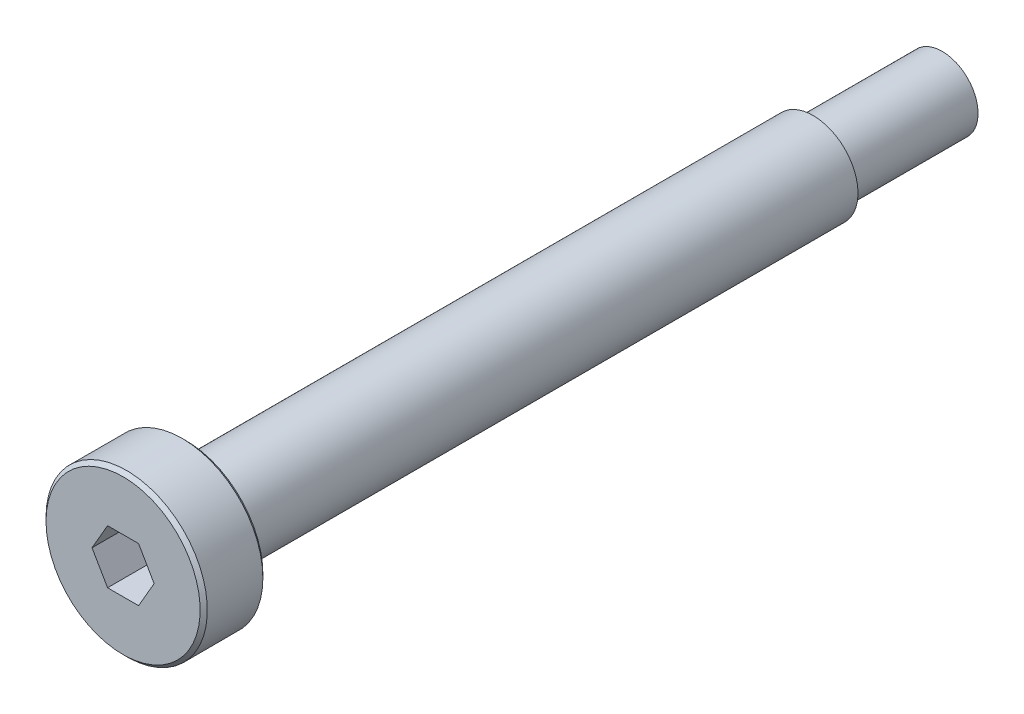
ISO-10303-21;
HEADER;
FILE_DESCRIPTION(('STEP AP214'),'2;1');
FILE_NAME('part.step','',(''),(''),'','','');
FILE_SCHEMA(('AUTOMOTIVE_DESIGN { 1 0 10303 214 1 1 1 1 }'));
ENDSEC;
DATA;
#1=APPLICATION_CONTEXT('core data for automotive mechanical design processes');
#2=APPLICATION_PROTOCOL_DEFINITION('international standard','automotive_design',2000,#1);
#3=PRODUCT_CONTEXT('',#1,'mechanical');
#4=PRODUCT('Part','Part','',(#3));
#5=PRODUCT_RELATED_PRODUCT_CATEGORY('part','',(#4));
#6=PRODUCT_DEFINITION_FORMATION('','',#4);
#7=PRODUCT_DEFINITION_CONTEXT('part definition',#1,'design');
#8=PRODUCT_DEFINITION('design','',#6,#7);
#9=PRODUCT_DEFINITION_SHAPE('','',#8);
#10=(LENGTH_UNIT() NAMED_UNIT(*) SI_UNIT(.MILLI.,.METRE.));
#11=(NAMED_UNIT(*) PLANE_ANGLE_UNIT() SI_UNIT($,.RADIAN.));
#12=(NAMED_UNIT(*) SI_UNIT($,.STERADIAN.) SOLID_ANGLE_UNIT());
#13=UNCERTAINTY_MEASURE_WITH_UNIT(LENGTH_MEASURE(1.E-05),#10,'distance_accuracy_value','');
#14=(GEOMETRIC_REPRESENTATION_CONTEXT(3) GLOBAL_UNCERTAINTY_ASSIGNED_CONTEXT((#13)) GLOBAL_UNIT_ASSIGNED_CONTEXT((#10,
#11,#12)) REPRESENTATION_CONTEXT('',''));
#15=CARTESIAN_POINT('',(0.,0.,0.));
#16=DIRECTION('',(0.,0.,1.));
#17=DIRECTION('',(1.,0.,0.));
#18=AXIS2_PLACEMENT_3D('',#15,#16,#17);
#19=CARTESIAN_POINT('',(0.,0.,0.));
#20=DIRECTION('',(0.,0.,-1.));
#21=DIRECTION('',(-1.,0.,0.));
#22=AXIS2_PLACEMENT_3D('',#19,#20,#21);
#23=PLANE('',#22);
#24=CARTESIAN_POINT('',(0.,0.,0.));
#25=DIRECTION('',(0.,0.,-1.));
#26=DIRECTION('',(-1.,0.,0.));
#27=AXIS2_PLACEMENT_3D('',#24,#25,#26);
#28=CIRCLE('',#27,4.29999999999999);
#29=CARTESIAN_POINT('',(-4.29999999999999,0.,0.));
#30=VERTEX_POINT('',#29);
#31=EDGE_CURVE('E11',#30,#30,#28,.F.);
#32=ORIENTED_EDGE('',*,*,#31,.T.);
#33=EDGE_LOOP('',(#32));
#34=FACE_BOUND('',#33,.T.);
#35=DIRECTION('',(-0.5,0.866025403784438,0.));
#36=VECTOR('',#35,1.);
#37=CARTESIAN_POINT('',(1.73205080756888,0.,0.));
#38=LINE('',#37,#36);
#39=CARTESIAN_POINT('',(1.73205080756888,0.,0.));
#40=VERTEX_POINT('',#39);
#41=CARTESIAN_POINT('',(0.866025403784438,1.5,0.));
#42=VERTEX_POINT('',#41);
#43=EDGE_CURVE('E135',#40,#42,#38,.T.);
#44=ORIENTED_EDGE('',*,*,#43,.F.);
#45=DIRECTION('',(0.5,0.866025403784439,0.));
#46=VECTOR('',#45,1.);
#47=CARTESIAN_POINT('',(0.86602540378444,-1.5,0.));
#48=LINE('',#47,#46);
#49=CARTESIAN_POINT('',(0.86602540378444,-1.5,0.));
#50=VERTEX_POINT('',#49);
#51=EDGE_CURVE('E61',#50,#40,#48,.T.);
#52=ORIENTED_EDGE('',*,*,#51,.F.);
#53=DIRECTION('',(1.,0.,0.));
#54=VECTOR('',#53,1.);
#55=CARTESIAN_POINT('',(-0.866025403784438,-1.5,0.));
#56=LINE('',#55,#54);
#57=CARTESIAN_POINT('',(-0.866025403784438,-1.5,0.));
#58=VERTEX_POINT('',#57);
#59=EDGE_CURVE('E144',#58,#50,#56,.T.);
#60=ORIENTED_EDGE('',*,*,#59,.F.);
#61=DIRECTION('',(0.5,-0.866025403784439,0.));
#62=VECTOR('',#61,1.);
#63=CARTESIAN_POINT('',(-1.73205080756888,0.,0.));
#64=LINE('',#63,#62);
#65=CARTESIAN_POINT('',(-1.73205080756888,0.,0.));
#66=VERTEX_POINT('',#65);
#67=EDGE_CURVE('E142',#66,#58,#64,.T.);
#68=ORIENTED_EDGE('',*,*,#67,.F.);
#69=DIRECTION('',(-0.5,-0.866025403784439,0.));
#70=VECTOR('',#69,1.);
#71=CARTESIAN_POINT('',(-0.866025403784439,1.5,0.));
#72=LINE('',#71,#70);
#73=CARTESIAN_POINT('',(-0.866025403784439,1.5,0.));
#74=VERTEX_POINT('',#73);
#75=EDGE_CURVE('E109',#74,#66,#72,.T.);
#76=ORIENTED_EDGE('',*,*,#75,.F.);
#77=DIRECTION('',(-1.,0.,0.));
#78=VECTOR('',#77,1.);
#79=CARTESIAN_POINT('',(0.866025403784438,1.5,0.));
#80=LINE('',#79,#78);
#81=EDGE_CURVE('E138',#42,#74,#80,.T.);
#82=ORIENTED_EDGE('',*,*,#81,.F.);
#83=EDGE_LOOP('',(#44,#52,#60,#68,#76,#82));
#84=FACE_BOUND('',#83,.T.);
#85=ADVANCED_FACE('F45',(#34,#84),#23,.F.);
#86=CARTESIAN_POINT('',(0.,0.,-45.7));
#87=DIRECTION('',(0.,0.,-1.));
#88=DIRECTION('',(-1.,0.,0.));
#89=AXIS2_PLACEMENT_3D('',#86,#87,#88);
#90=CYLINDRICAL_SURFACE('',#89,4.5);
#91=CARTESIAN_POINT('',(0.,0.,-3.3));
#92=DIRECTION('',(0.,0.,1.));
#93=DIRECTION('',(1.,0.,0.));
#94=AXIS2_PLACEMENT_3D('',#91,#92,#93);
#95=CIRCLE('',#94,4.5);
#96=CARTESIAN_POINT('',(4.5,0.,-3.3));
#97=VERTEX_POINT('',#96);
#98=EDGE_CURVE('E54',#97,#97,#95,.T.);
#99=ORIENTED_EDGE('',*,*,#98,.T.);
#100=EDGE_LOOP('',(#99));
#101=FACE_BOUND('',#100,.T.);
#102=CARTESIAN_POINT('',(0.,0.,-0.200000000000013));
#103=DIRECTION('',(0.,0.,-1.));
#104=DIRECTION('',(-1.,0.,0.));
#105=AXIS2_PLACEMENT_3D('',#102,#103,#104);
#106=CIRCLE('',#105,4.5);
#107=CARTESIAN_POINT('',(-4.5,0.,-0.200000000000013));
#108=VERTEX_POINT('',#107);
#109=EDGE_CURVE('E168',#108,#108,#106,.T.);
#110=ORIENTED_EDGE('',*,*,#109,.T.);
#111=EDGE_LOOP('',(#110));
#112=FACE_BOUND('',#111,.T.);
#113=ADVANCED_FACE('F173',(#101,#112),#90,.T.);
#114=CARTESIAN_POINT('',(0.,-4.5,-3.5));
#115=DIRECTION('',(0.,0.,1.));
#116=DIRECTION('',(1.,0.,0.));
#117=AXIS2_PLACEMENT_3D('',#114,#115,#116);
#118=PLANE('',#117);
#119=CARTESIAN_POINT('',(0.,0.,-3.5));
#120=DIRECTION('',(0.,0.,1.));
#121=DIRECTION('',(1.,0.,0.));
#122=AXIS2_PLACEMENT_3D('',#119,#120,#121);
#123=CIRCLE('',#122,4.3);
#124=CARTESIAN_POINT('',(4.3,0.,-3.5));
#125=VERTEX_POINT('',#124);
#126=EDGE_CURVE('E165',#125,#125,#123,.F.);
#127=ORIENTED_EDGE('',*,*,#126,.T.);
#128=EDGE_LOOP('',(#127));
#129=FACE_BOUND('',#128,.T.);
#130=CARTESIAN_POINT('',(0.,0.,-3.5));
#131=DIRECTION('',(0.,0.,-1.));
#132=DIRECTION('',(-1.,0.,0.));
#133=AXIS2_PLACEMENT_3D('',#130,#131,#132);
#134=CIRCLE('',#133,2.5);
#135=CARTESIAN_POINT('',(-2.5,0.,-3.5));
#136=VERTEX_POINT('',#135);
#137=EDGE_CURVE('E162',#136,#136,#134,.T.);
#138=ORIENTED_EDGE('',*,*,#137,.F.);
#139=EDGE_LOOP('',(#138));
#140=FACE_BOUND('',#139,.T.);
#141=ADVANCED_FACE('F181',(#129,#140),#118,.F.);
#142=CARTESIAN_POINT('',(0.,0.,-45.7));
#143=DIRECTION('',(0.,0.,-1.));
#144=DIRECTION('',(-1.,0.,0.));
#145=AXIS2_PLACEMENT_3D('',#142,#143,#144);
#146=CYLINDRICAL_SURFACE('',#145,2.5);
#147=CARTESIAN_POINT('',(0.,0.,-38.5));
#148=DIRECTION('',(0.,0.,-1.));
#149=DIRECTION('',(-1.,0.,0.));
#150=AXIS2_PLACEMENT_3D('',#147,#148,#149);
#151=CIRCLE('',#150,2.5);
#152=CARTESIAN_POINT('',(-2.5,0.,-38.5));
#153=VERTEX_POINT('',#152);
#154=EDGE_CURVE('E159',#153,#153,#151,.T.);
#155=ORIENTED_EDGE('',*,*,#154,.F.);
#156=EDGE_LOOP('',(#155));
#157=FACE_BOUND('',#156,.T.);
#158=ORIENTED_EDGE('',*,*,#137,.T.);
#159=EDGE_LOOP('',(#158));
#160=FACE_BOUND('',#159,.T.);
#161=ADVANCED_FACE('F184',(#157,#160),#146,.T.);
#162=CARTESIAN_POINT('',(0.,-2.5,-38.5));
#163=DIRECTION('',(0.,0.,1.));
#164=DIRECTION('',(1.,0.,0.));
#165=AXIS2_PLACEMENT_3D('',#162,#163,#164);
#166=PLANE('',#165);
#167=CARTESIAN_POINT('',(0.,0.,-38.5));
#168=DIRECTION('',(0.,0.,-1.));
#169=DIRECTION('',(-1.,0.,0.));
#170=AXIS2_PLACEMENT_3D('',#167,#168,#169);
#171=CIRCLE('',#170,2.);
#172=CARTESIAN_POINT('',(-2.,0.,-38.5));
#173=VERTEX_POINT('',#172);
#174=EDGE_CURVE('E156',#173,#173,#171,.T.);
#175=ORIENTED_EDGE('',*,*,#174,.F.);
#176=EDGE_LOOP('',(#175));
#177=FACE_BOUND('',#176,.T.);
#178=ORIENTED_EDGE('',*,*,#154,.T.);
#179=EDGE_LOOP('',(#178));
#180=FACE_BOUND('',#179,.T.);
#181=ADVANCED_FACE('F189',(#177,#180),#166,.F.);
#182=CARTESIAN_POINT('',(0.,0.,-45.7));
#183=DIRECTION('',(0.,0.,-1.));
#184=DIRECTION('',(-1.,0.,0.));
#185=AXIS2_PLACEMENT_3D('',#182,#183,#184);
#186=CYLINDRICAL_SURFACE('',#185,2.);
#187=CARTESIAN_POINT('',(0.,0.,-45.7));
#188=DIRECTION('',(0.,0.,-1.));
#189=DIRECTION('',(-1.,0.,0.));
#190=AXIS2_PLACEMENT_3D('',#187,#188,#189);
#191=CIRCLE('',#190,2.);
#192=CARTESIAN_POINT('',(-2.,0.,-45.7));
#193=VERTEX_POINT('',#192);
#194=EDGE_CURVE('E148',#193,#193,#191,.T.);
#195=ORIENTED_EDGE('',*,*,#194,.F.);
#196=EDGE_LOOP('',(#195));
#197=FACE_BOUND('',#196,.T.);
#198=ORIENTED_EDGE('',*,*,#174,.T.);
#199=EDGE_LOOP('',(#198));
#200=FACE_BOUND('',#199,.T.);
#201=ADVANCED_FACE('F195',(#197,#200),#186,.T.);
#202=CARTESIAN_POINT('',(0.,-2.,-45.7));
#203=DIRECTION('',(0.,0.,1.));
#204=DIRECTION('',(1.,0.,0.));
#205=AXIS2_PLACEMENT_3D('',#202,#203,#204);
#206=PLANE('',#205);
#207=ORIENTED_EDGE('',*,*,#194,.T.);
#208=EDGE_LOOP('',(#207));
#209=FACE_BOUND('',#208,.T.);
#210=ADVANCED_FACE('F223',(#209),#206,.F.);
#211=CARTESIAN_POINT('',(0.86602540378444,-1.5,-3.));
#212=DIRECTION('',(0.866025403784439,-0.5,0.));
#213=DIRECTION('',(0.5,0.866025403784439,0.));
#214=AXIS2_PLACEMENT_3D('',#211,#212,#213);
#215=PLANE('',#214);
#216=ORIENTED_EDGE('',*,*,#51,.T.);
#217=DIRECTION('',(0.,0.,1.));
#218=VECTOR('',#217,1.);
#219=CARTESIAN_POINT('',(1.73205080756888,0.,-3.));
#220=LINE('',#219,#218);
#221=CARTESIAN_POINT('',(1.73205080756888,0.,-3.));
#222=VERTEX_POINT('',#221);
#223=EDGE_CURVE('E91',#222,#40,#220,.T.);
#224=ORIENTED_EDGE('',*,*,#223,.F.);
#225=DIRECTION('',(0.5,0.866025403784439,0.));
#226=VECTOR('',#225,1.);
#227=CARTESIAN_POINT('',(0.86602540378444,-1.5,-3.));
#228=LINE('',#227,#226);
#229=CARTESIAN_POINT('',(0.86602540378444,-1.5,-3.));
#230=VERTEX_POINT('',#229);
#231=EDGE_CURVE('E146',#230,#222,#228,.T.);
#232=ORIENTED_EDGE('',*,*,#231,.F.);
#233=DIRECTION('',(0.,0.,1.));
#234=VECTOR('',#233,1.);
#235=CARTESIAN_POINT('',(0.86602540378444,-1.5,-3.));
#236=LINE('',#235,#234);
#237=EDGE_CURVE('E69',#230,#50,#236,.T.);
#238=ORIENTED_EDGE('',*,*,#237,.T.);
#239=EDGE_LOOP('',(#216,#224,#232,#238));
#240=FACE_BOUND('',#239,.T.);
#241=ADVANCED_FACE('F220',(#240),#215,.F.);
#242=CARTESIAN_POINT('',(-0.866025403784438,-1.5,-3.));
#243=DIRECTION('',(0.,-1.,0.));
#244=DIRECTION('',(0.,0.,-1.));
#245=AXIS2_PLACEMENT_3D('',#242,#243,#244);
#246=PLANE('',#245);
#247=ORIENTED_EDGE('',*,*,#59,.T.);
#248=ORIENTED_EDGE('',*,*,#237,.F.);
#249=DIRECTION('',(1.,0.,0.));
#250=VECTOR('',#249,1.);
#251=CARTESIAN_POINT('',(-0.866025403784438,-1.5,-3.));
#252=LINE('',#251,#250);
#253=CARTESIAN_POINT('',(-0.866025403784438,-1.5,-3.));
#254=VERTEX_POINT('',#253);
#255=EDGE_CURVE('E121',#254,#230,#252,.T.);
#256=ORIENTED_EDGE('',*,*,#255,.F.);
#257=DIRECTION('',(0.,0.,1.));
#258=VECTOR('',#257,1.);
#259=CARTESIAN_POINT('',(-0.866025403784438,-1.5,-3.));
#260=LINE('',#259,#258);
#261=EDGE_CURVE('E113',#254,#58,#260,.T.);
#262=ORIENTED_EDGE('',*,*,#261,.T.);
#263=EDGE_LOOP('',(#247,#248,#256,#262));
#264=FACE_BOUND('',#263,.T.);
#265=ADVANCED_FACE('F222',(#264),#246,.F.);
#266=CARTESIAN_POINT('',(-1.73205080756888,0.,-3.));
#267=DIRECTION('',(-0.866025403784439,-0.5,0.));
#268=DIRECTION('',(0.5,-0.866025403784439,0.));
#269=AXIS2_PLACEMENT_3D('',#266,#267,#268);
#270=PLANE('',#269);
#271=ORIENTED_EDGE('',*,*,#67,.T.);
#272=ORIENTED_EDGE('',*,*,#261,.F.);
#273=DIRECTION('',(0.5,-0.866025403784439,0.));
#274=VECTOR('',#273,1.);
#275=CARTESIAN_POINT('',(-1.73205080756888,0.,-3.));
#276=LINE('',#275,#274);
#277=CARTESIAN_POINT('',(-1.73205080756888,0.,-3.));
#278=VERTEX_POINT('',#277);
#279=EDGE_CURVE('E117',#278,#254,#276,.T.);
#280=ORIENTED_EDGE('',*,*,#279,.F.);
#281=DIRECTION('',(0.,0.,1.));
#282=VECTOR('',#281,1.);
#283=CARTESIAN_POINT('',(-1.73205080756888,0.,-3.));
#284=LINE('',#283,#282);
#285=EDGE_CURVE('E102',#278,#66,#284,.T.);
#286=ORIENTED_EDGE('',*,*,#285,.T.);
#287=EDGE_LOOP('',(#271,#272,#280,#286));
#288=FACE_BOUND('',#287,.T.);
#289=ADVANCED_FACE('F118',(#288),#270,.F.);
#290=CARTESIAN_POINT('',(-0.866025403784439,1.5,-3.));
#291=DIRECTION('',(-0.866025403784439,0.5,0.));
#292=DIRECTION('',(-0.5,-0.866025403784439,0.));
#293=AXIS2_PLACEMENT_3D('',#290,#291,#292);
#294=PLANE('',#293);
#295=ORIENTED_EDGE('',*,*,#75,.T.);
#296=ORIENTED_EDGE('',*,*,#285,.F.);
#297=DIRECTION('',(-0.5,-0.866025403784439,0.));
#298=VECTOR('',#297,1.);
#299=CARTESIAN_POINT('',(-0.866025403784439,1.5,-3.));
#300=LINE('',#299,#298);
#301=CARTESIAN_POINT('',(-0.866025403784439,1.5,-3.));
#302=VERTEX_POINT('',#301);
#303=EDGE_CURVE('E106',#302,#278,#300,.T.);
#304=ORIENTED_EDGE('',*,*,#303,.F.);
#305=DIRECTION('',(0.,0.,1.));
#306=VECTOR('',#305,1.);
#307=CARTESIAN_POINT('',(-0.866025403784439,1.5,-3.));
#308=LINE('',#307,#306);
#309=EDGE_CURVE('E114',#302,#74,#308,.T.);
#310=ORIENTED_EDGE('',*,*,#309,.T.);
#311=EDGE_LOOP('',(#295,#296,#304,#310));
#312=FACE_BOUND('',#311,.T.);
#313=ADVANCED_FACE('F104',(#312),#294,.F.);
#314=CARTESIAN_POINT('',(0.866025403784438,1.5,-3.));
#315=DIRECTION('',(0.,1.,0.));
#316=DIRECTION('',(-1.,0.,0.));
#317=AXIS2_PLACEMENT_3D('',#314,#315,#316);
#318=PLANE('',#317);
#319=ORIENTED_EDGE('',*,*,#81,.T.);
#320=ORIENTED_EDGE('',*,*,#309,.F.);
#321=DIRECTION('',(-1.,0.,0.));
#322=VECTOR('',#321,1.);
#323=CARTESIAN_POINT('',(0.866025403784438,1.5,-3.));
#324=LINE('',#323,#322);
#325=CARTESIAN_POINT('',(0.866025403784438,1.5,-3.));
#326=VERTEX_POINT('',#325);
#327=EDGE_CURVE('E127',#326,#302,#324,.T.);
#328=ORIENTED_EDGE('',*,*,#327,.F.);
#329=DIRECTION('',(0.,0.,1.));
#330=VECTOR('',#329,1.);
#331=CARTESIAN_POINT('',(0.866025403784438,1.5,-3.));
#332=LINE('',#331,#330);
#333=EDGE_CURVE('E151',#326,#42,#332,.T.);
#334=ORIENTED_EDGE('',*,*,#333,.T.);
#335=EDGE_LOOP('',(#319,#320,#328,#334));
#336=FACE_BOUND('',#335,.T.);
#337=ADVANCED_FACE('F280',(#336),#318,.F.);
#338=CARTESIAN_POINT('',(1.73205080756888,0.,-3.));
#339=DIRECTION('',(0.866025403784438,0.5,0.));
#340=DIRECTION('',(-0.5,0.866025403784439,0.));
#341=AXIS2_PLACEMENT_3D('',#338,#339,#340);
#342=PLANE('',#341);
#343=ORIENTED_EDGE('',*,*,#43,.T.);
#344=ORIENTED_EDGE('',*,*,#333,.F.);
#345=DIRECTION('',(-0.5,0.866025403784438,0.));
#346=VECTOR('',#345,1.);
#347=CARTESIAN_POINT('',(1.73205080756888,0.,-3.));
#348=LINE('',#347,#346);
#349=EDGE_CURVE('E129',#222,#326,#348,.T.);
#350=ORIENTED_EDGE('',*,*,#349,.F.);
#351=ORIENTED_EDGE('',*,*,#223,.T.);
#352=EDGE_LOOP('',(#343,#344,#350,#351));
#353=FACE_BOUND('',#352,.T.);
#354=ADVANCED_FACE('F218',(#353),#342,.F.);
#355=CARTESIAN_POINT('',(0.,0.,-3.));
#356=DIRECTION('',(0.,0.,1.));
#357=DIRECTION('',(1.,0.,0.));
#358=AXIS2_PLACEMENT_3D('',#355,#356,#357);
#359=PLANE('',#358);
#360=ORIENTED_EDGE('',*,*,#231,.T.);
#361=ORIENTED_EDGE('',*,*,#349,.T.);
#362=ORIENTED_EDGE('',*,*,#327,.T.);
#363=ORIENTED_EDGE('',*,*,#303,.T.);
#364=ORIENTED_EDGE('',*,*,#279,.T.);
#365=ORIENTED_EDGE('',*,*,#255,.T.);
#366=EDGE_LOOP('',(#360,#361,#362,#363,#364,#365));
#367=FACE_BOUND('',#366,.T.);
#368=ADVANCED_FACE('F124',(#367),#359,.T.);
#369=CARTESIAN_POINT('',(0.,0.,-3.5));
#370=DIRECTION('',(0.,0.,1.));
#371=DIRECTION('',(1.,0.,0.));
#372=AXIS2_PLACEMENT_3D('',#369,#370,#371);
#373=CONICAL_SURFACE('',#372,4.3,0.785398163397455);
#374=ORIENTED_EDGE('',*,*,#98,.F.);
#375=EDGE_LOOP('',(#374));
#376=FACE_BOUND('',#375,.T.);
#377=ORIENTED_EDGE('',*,*,#126,.F.);
#378=EDGE_LOOP('',(#377));
#379=FACE_BOUND('',#378,.T.);
#380=ADVANCED_FACE('F176',(#376,#379),#373,.T.);
#381=CARTESIAN_POINT('',(0.,0.,-0.200000000000013));
#382=DIRECTION('',(0.,0.,-1.));
#383=DIRECTION('',(-1.,0.,0.));
#384=AXIS2_PLACEMENT_3D('',#381,#382,#383);
#385=CONICAL_SURFACE('',#384,4.5,0.785398163397438);
#386=ORIENTED_EDGE('',*,*,#31,.F.);
#387=EDGE_LOOP('',(#386));
#388=FACE_BOUND('',#387,.T.);
#389=ORIENTED_EDGE('',*,*,#109,.F.);
#390=EDGE_LOOP('',(#389));
#391=FACE_BOUND('',#390,.T.);
#392=ADVANCED_FACE('F48',(#388,#391),#385,.T.);
#393=CLOSED_SHELL('',(#85,#113,#141,#161,#181,#201,#210,#241,#265,#289,#313,#337,#354,#368,#380,#392));
#394=MANIFOLD_SOLID_BREP('B2',#393);
#395=ADVANCED_BREP_SHAPE_REPRESENTATION('',(#18,#394),#14);
#396=SHAPE_DEFINITION_REPRESENTATION(#9,#395);
ENDSEC;
END-ISO-10303-21;
